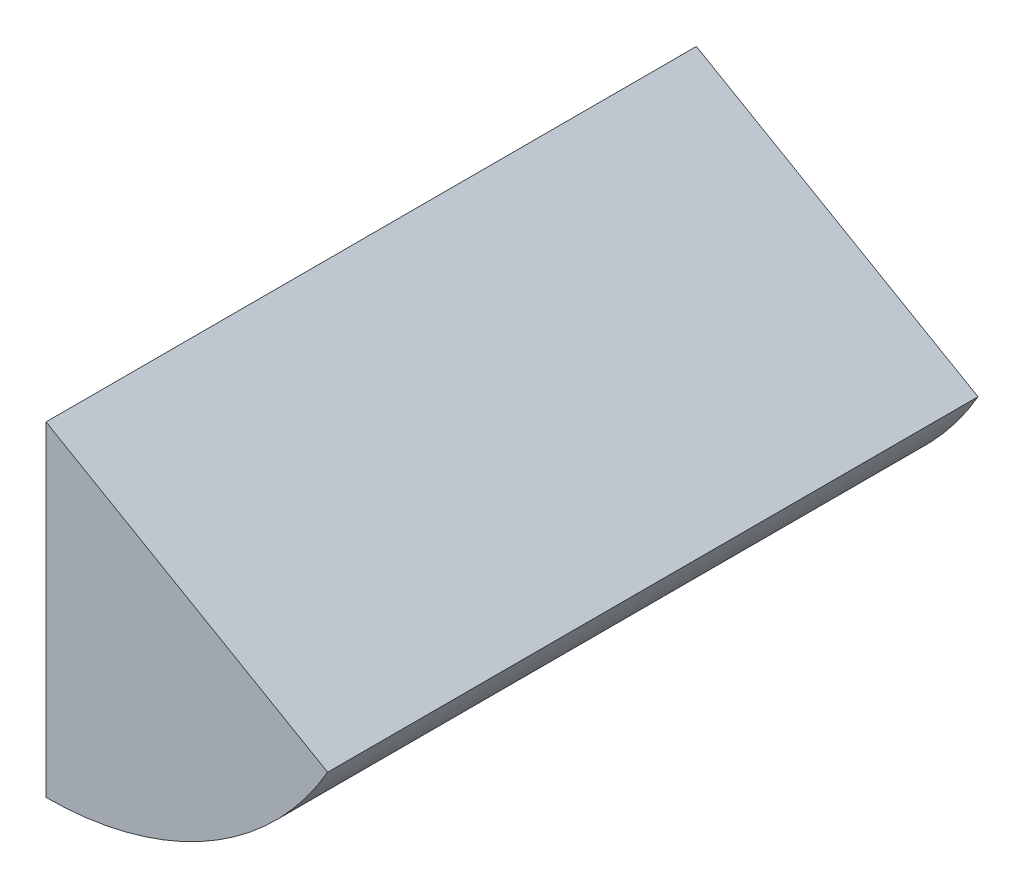
ISO-10303-21;
HEADER;
FILE_DESCRIPTION(('STEP AP214'),'2;1');
FILE_NAME('part.step','',(''),(''),'','','');
FILE_SCHEMA(('AUTOMOTIVE_DESIGN { 1 0 10303 214 1 1 1 1 }'));
ENDSEC;
DATA;
#1=APPLICATION_CONTEXT('core data for automotive mechanical design processes');
#2=APPLICATION_PROTOCOL_DEFINITION('international standard','automotive_design',2000,#1);
#3=PRODUCT_CONTEXT('',#1,'mechanical');
#4=PRODUCT('Part','Part','',(#3));
#5=PRODUCT_RELATED_PRODUCT_CATEGORY('part','',(#4));
#6=PRODUCT_DEFINITION_FORMATION('','',#4);
#7=PRODUCT_DEFINITION_CONTEXT('part definition',#1,'design');
#8=PRODUCT_DEFINITION('design','',#6,#7);
#9=PRODUCT_DEFINITION_SHAPE('','',#8);
#10=(LENGTH_UNIT() NAMED_UNIT(*) SI_UNIT(.MILLI.,.METRE.));
#11=(NAMED_UNIT(*) PLANE_ANGLE_UNIT() SI_UNIT($,.RADIAN.));
#12=(NAMED_UNIT(*) SI_UNIT($,.STERADIAN.) SOLID_ANGLE_UNIT());
#13=UNCERTAINTY_MEASURE_WITH_UNIT(LENGTH_MEASURE(1.E-05),#10,'distance_accuracy_value','');
#14=(GEOMETRIC_REPRESENTATION_CONTEXT(3) GLOBAL_UNCERTAINTY_ASSIGNED_CONTEXT((#13)) GLOBAL_UNIT_ASSIGNED_CONTEXT((#10,
#11,#12)) REPRESENTATION_CONTEXT('',''));
#15=CARTESIAN_POINT('',(0.,0.,0.));
#16=DIRECTION('',(0.,0.,1.));
#17=DIRECTION('',(1.,0.,0.));
#18=AXIS2_PLACEMENT_3D('',#15,#16,#17);
#19=CARTESIAN_POINT('',(0.,0.,50.));
#20=DIRECTION('',(-0.499999999999998,-0.86602540378444,0.));
#21=DIRECTION('',(0.86602540378444,-0.499999999999998,0.));
#22=AXIS2_PLACEMENT_3D('',#19,#20,#21);
#23=PLANE('',#22);
#24=DIRECTION('',(-0.86602540378444,0.499999999999998,0.));
#25=VECTOR('',#24,1.);
#26=CARTESIAN_POINT('',(0.,0.,0.));
#27=LINE('',#26,#25);
#28=CARTESIAN_POINT('',(21.650635094611,-12.5,0.));
#29=VERTEX_POINT('',#28);
#30=CARTESIAN_POINT('',(0.,0.,0.));
#31=VERTEX_POINT('',#30);
#32=EDGE_CURVE('E80',#29,#31,#27,.T.);
#33=ORIENTED_EDGE('',*,*,#32,.T.);
#34=DIRECTION('',(0.,0.,-1.));
#35=VECTOR('',#34,1.);
#36=CARTESIAN_POINT('',(0.,0.,50.));
#37=LINE('',#36,#35);
#38=CARTESIAN_POINT('',(0.,0.,50.));
#39=VERTEX_POINT('',#38);
#40=EDGE_CURVE('E11',#39,#31,#37,.T.);
#41=ORIENTED_EDGE('',*,*,#40,.F.);
#42=DIRECTION('',(-0.86602540378444,0.499999999999998,0.));
#43=VECTOR('',#42,1.);
#44=CARTESIAN_POINT('',(0.,0.,50.));
#45=LINE('',#44,#43);
#46=CARTESIAN_POINT('',(21.650635094611,-12.5,50.));
#47=VERTEX_POINT('',#46);
#48=EDGE_CURVE('E73',#47,#39,#45,.T.);
#49=ORIENTED_EDGE('',*,*,#48,.F.);
#50=DIRECTION('',(0.,0.,-1.));
#51=VECTOR('',#50,1.);
#52=CARTESIAN_POINT('',(21.650635094611,-12.5,50.));
#53=LINE('',#52,#51);
#54=EDGE_CURVE('E81',#47,#29,#53,.T.);
#55=ORIENTED_EDGE('',*,*,#54,.T.);
#56=EDGE_LOOP('',(#33,#41,#49,#55));
#57=FACE_BOUND('',#56,.T.);
#58=ADVANCED_FACE('F33',(#57),#23,.F.);
#59=CARTESIAN_POINT('',(0.,0.,50.));
#60=DIRECTION('',(1.,0.,0.));
#61=DIRECTION('',(0.,0.,-1.));
#62=AXIS2_PLACEMENT_3D('',#59,#60,#61);
#63=PLANE('',#62);
#64=DIRECTION('',(0.,-1.,0.));
#65=VECTOR('',#64,1.);
#66=CARTESIAN_POINT('',(0.,0.,0.));
#67=LINE('',#66,#65);
#68=CARTESIAN_POINT('',(0.,-25.,0.));
#69=VERTEX_POINT('',#68);
#70=EDGE_CURVE('E61',#31,#69,#67,.T.);
#71=ORIENTED_EDGE('',*,*,#70,.T.);
#72=DIRECTION('',(0.,0.,-1.));
#73=VECTOR('',#72,1.);
#74=CARTESIAN_POINT('',(0.,-25.,50.));
#75=LINE('',#74,#73);
#76=CARTESIAN_POINT('',(0.,-25.,50.));
#77=VERTEX_POINT('',#76);
#78=EDGE_CURVE('E41',#77,#69,#75,.T.);
#79=ORIENTED_EDGE('',*,*,#78,.F.);
#80=DIRECTION('',(0.,-1.,0.));
#81=VECTOR('',#80,1.);
#82=CARTESIAN_POINT('',(0.,0.,50.));
#83=LINE('',#82,#81);
#84=EDGE_CURVE('E69',#39,#77,#83,.T.);
#85=ORIENTED_EDGE('',*,*,#84,.F.);
#86=ORIENTED_EDGE('',*,*,#40,.T.);
#87=EDGE_LOOP('',(#71,#79,#85,#86));
#88=FACE_BOUND('',#87,.T.);
#89=ADVANCED_FACE('F70',(#88),#63,.F.);
#90=CARTESIAN_POINT('',(0.,0.,50.));
#91=DIRECTION('',(0.,0.,-1.));
#92=DIRECTION('',(-1.,0.,0.));
#93=AXIS2_PLACEMENT_3D('',#90,#91,#92);
#94=CYLINDRICAL_SURFACE('',#93,25.);
#95=CARTESIAN_POINT('',(0.,0.,0.));
#96=DIRECTION('',(0.,0.,1.));
#97=DIRECTION('',(1.,0.,0.));
#98=AXIS2_PLACEMENT_3D('',#95,#96,#97);
#99=CIRCLE('',#98,25.);
#100=EDGE_CURVE('E66',#69,#29,#99,.T.);
#101=ORIENTED_EDGE('',*,*,#100,.T.);
#102=ORIENTED_EDGE('',*,*,#54,.F.);
#103=CARTESIAN_POINT('',(0.,0.,50.));
#104=DIRECTION('',(0.,0.,1.));
#105=DIRECTION('',(1.,0.,0.));
#106=AXIS2_PLACEMENT_3D('',#103,#104,#105);
#107=CIRCLE('',#106,25.);
#108=EDGE_CURVE('E49',#77,#47,#107,.T.);
#109=ORIENTED_EDGE('',*,*,#108,.F.);
#110=ORIENTED_EDGE('',*,*,#78,.T.);
#111=EDGE_LOOP('',(#101,#102,#109,#110));
#112=FACE_BOUND('',#111,.T.);
#113=ADVANCED_FACE('F92',(#112),#94,.T.);
#114=CARTESIAN_POINT('',(0.,0.,50.));
#115=DIRECTION('',(0.,0.,1.));
#116=DIRECTION('',(1.,0.,0.));
#117=AXIS2_PLACEMENT_3D('',#114,#115,#116);
#118=PLANE('',#117);
#119=ORIENTED_EDGE('',*,*,#48,.T.);
#120=ORIENTED_EDGE('',*,*,#84,.T.);
#121=ORIENTED_EDGE('',*,*,#108,.T.);
#122=EDGE_LOOP('',(#119,#120,#121));
#123=FACE_BOUND('',#122,.T.);
#124=ADVANCED_FACE('F76',(#123),#118,.T.);
#125=CARTESIAN_POINT('',(0.,0.,0.));
#126=DIRECTION('',(0.,0.,1.));
#127=DIRECTION('',(1.,0.,0.));
#128=AXIS2_PLACEMENT_3D('',#125,#126,#127);
#129=PLANE('',#128);
#130=CARTESIAN_POINT('',(7.9918097092765,-13.850442103361,0.));
#131=DIRECTION('',(0.,0.,-1.));
#132=DIRECTION('',(-1.,0.,0.));
#133=AXIS2_PLACEMENT_3D('',#130,#131,#132);
#134=CIRCLE('',#133,5.);
#135=CARTESIAN_POINT('',(2.9918097092765,-13.850442103361,0.));
#136=VERTEX_POINT('',#135);
#137=EDGE_CURVE('E87',#136,#136,#134,.T.);
#138=ORIENTED_EDGE('',*,*,#137,.F.);
#139=EDGE_LOOP('',(#138));
#140=FACE_BOUND('',#139,.T.);
#141=ORIENTED_EDGE('',*,*,#32,.F.);
#142=ORIENTED_EDGE('',*,*,#100,.F.);
#143=ORIENTED_EDGE('',*,*,#70,.F.);
#144=EDGE_LOOP('',(#141,#142,#143));
#145=FACE_BOUND('',#144,.T.);
#146=ADVANCED_FACE('F93',(#140,#145),#129,.F.);
#147=CARTESIAN_POINT('',(7.9918097092765,-13.850442103361,10.));
#148=DIRECTION('',(0.,0.,-1.));
#149=DIRECTION('',(-1.,0.,0.));
#150=AXIS2_PLACEMENT_3D('',#147,#148,#149);
#151=CYLINDRICAL_SURFACE('',#150,5.);
#152=CARTESIAN_POINT('',(7.9918097092765,-13.850442103361,10.));
#153=DIRECTION('',(0.,0.,-1.));
#154=DIRECTION('',(-1.,0.,0.));
#155=AXIS2_PLACEMENT_3D('',#152,#153,#154);
#156=CIRCLE('',#155,5.);
#157=CARTESIAN_POINT('',(2.9918097092765,-13.850442103361,10.));
#158=VERTEX_POINT('',#157);
#159=EDGE_CURVE('E83',#158,#158,#156,.T.);
#160=ORIENTED_EDGE('',*,*,#159,.F.);
#161=EDGE_LOOP('',(#160));
#162=FACE_BOUND('',#161,.T.);
#163=ORIENTED_EDGE('',*,*,#137,.T.);
#164=EDGE_LOOP('',(#163));
#165=FACE_BOUND('',#164,.T.);
#166=ADVANCED_FACE('F95',(#162,#165),#151,.F.);
#167=CARTESIAN_POINT('',(7.9918097092765,-13.850442103361,10.));
#168=DIRECTION('',(0.,0.,-1.));
#169=DIRECTION('',(-1.,0.,0.));
#170=AXIS2_PLACEMENT_3D('',#167,#168,#169);
#171=PLANE('',#170);
#172=ORIENTED_EDGE('',*,*,#159,.T.);
#173=EDGE_LOOP('',(#172));
#174=FACE_BOUND('',#173,.T.);
#175=ADVANCED_FACE('F102',(#174),#171,.T.);
#176=CLOSED_SHELL('',(#58,#89,#113,#124,#146,#166,#175));
#177=MANIFOLD_SOLID_BREP('B2',#176);
#178=ADVANCED_BREP_SHAPE_REPRESENTATION('',(#18,#177),#14);
#179=SHAPE_DEFINITION_REPRESENTATION(#9,#178);
ENDSEC;
END-ISO-10303-21;
